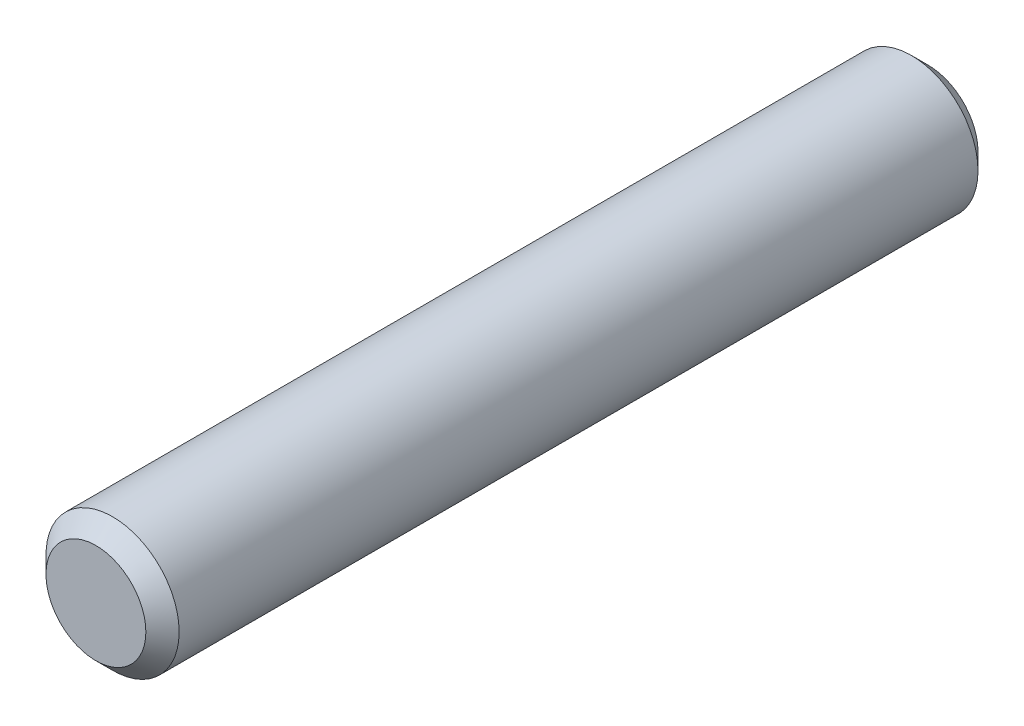
ISO-10303-21;
HEADER;
FILE_DESCRIPTION(('STEP AP214'),'2;1');
FILE_NAME('part.step','',(''),(''),'','','');
FILE_SCHEMA(('AUTOMOTIVE_DESIGN { 1 0 10303 214 1 1 1 1 }'));
ENDSEC;
DATA;
#1=APPLICATION_CONTEXT('core data for automotive mechanical design processes');
#2=APPLICATION_PROTOCOL_DEFINITION('international standard','automotive_design',2000,#1);
#3=PRODUCT_CONTEXT('',#1,'mechanical');
#4=PRODUCT('Part','Part','',(#3));
#5=PRODUCT_RELATED_PRODUCT_CATEGORY('part','',(#4));
#6=PRODUCT_DEFINITION_FORMATION('','',#4);
#7=PRODUCT_DEFINITION_CONTEXT('part definition',#1,'design');
#8=PRODUCT_DEFINITION('design','',#6,#7);
#9=PRODUCT_DEFINITION_SHAPE('','',#8);
#10=(LENGTH_UNIT() NAMED_UNIT(*) SI_UNIT(.MILLI.,.METRE.));
#11=(NAMED_UNIT(*) PLANE_ANGLE_UNIT() SI_UNIT($,.RADIAN.));
#12=(NAMED_UNIT(*) SI_UNIT($,.STERADIAN.) SOLID_ANGLE_UNIT());
#13=UNCERTAINTY_MEASURE_WITH_UNIT(LENGTH_MEASURE(1.E-05),#10,'distance_accuracy_value','');
#14=(GEOMETRIC_REPRESENTATION_CONTEXT(3) GLOBAL_UNCERTAINTY_ASSIGNED_CONTEXT((#13)) GLOBAL_UNIT_ASSIGNED_CONTEXT((#10,
#11,#12)) REPRESENTATION_CONTEXT('',''));
#15=CARTESIAN_POINT('',(0.,0.,0.));
#16=DIRECTION('',(0.,0.,1.));
#17=DIRECTION('',(1.,0.,0.));
#18=AXIS2_PLACEMENT_3D('',#15,#16,#17);
#19=CARTESIAN_POINT('',(0.,0.,50.));
#20=DIRECTION('',(0.,0.,-1.));
#21=DIRECTION('',(-1.,0.,0.));
#22=AXIS2_PLACEMENT_3D('',#19,#20,#21);
#23=CYLINDRICAL_SURFACE('',#22,4.);
#24=CARTESIAN_POINT('',(0.,0.,49.));
#25=DIRECTION('',(0.,0.,1.));
#26=DIRECTION('',(1.,0.,0.));
#27=AXIS2_PLACEMENT_3D('',#24,#25,#26);
#28=CIRCLE('',#27,4.);
#29=CARTESIAN_POINT('',(4.,0.,49.));
#30=VERTEX_POINT('',#29);
#31=EDGE_CURVE('E47',#30,#30,#28,.F.);
#32=ORIENTED_EDGE('',*,*,#31,.T.);
#33=EDGE_LOOP('',(#32));
#34=FACE_BOUND('',#33,.T.);
#35=CARTESIAN_POINT('',(0.,0.,1.));
#36=DIRECTION('',(0.,0.,1.));
#37=DIRECTION('',(1.,0.,0.));
#38=AXIS2_PLACEMENT_3D('',#35,#36,#37);
#39=CIRCLE('',#38,4.);
#40=CARTESIAN_POINT('',(4.,0.,1.));
#41=VERTEX_POINT('',#40);
#42=EDGE_CURVE('E52',#41,#41,#39,.T.);
#43=ORIENTED_EDGE('',*,*,#42,.T.);
#44=EDGE_LOOP('',(#43));
#45=FACE_BOUND('',#44,.T.);
#46=ADVANCED_FACE('F38',(#34,#45),#23,.T.);
#47=CARTESIAN_POINT('',(0.,0.,50.));
#48=DIRECTION('',(0.,0.,1.));
#49=DIRECTION('',(1.,0.,0.));
#50=AXIS2_PLACEMENT_3D('',#47,#48,#49);
#51=PLANE('',#50);
#52=CARTESIAN_POINT('',(0.,0.,50.));
#53=DIRECTION('',(0.,0.,1.));
#54=DIRECTION('',(1.,0.,0.));
#55=AXIS2_PLACEMENT_3D('',#52,#53,#54);
#56=CIRCLE('',#55,3.);
#57=CARTESIAN_POINT('',(3.,0.,50.));
#58=VERTEX_POINT('',#57);
#59=EDGE_CURVE('E57',#58,#58,#56,.T.);
#60=ORIENTED_EDGE('',*,*,#59,.T.);
#61=EDGE_LOOP('',(#60));
#62=FACE_BOUND('',#61,.T.);
#63=ADVANCED_FACE('F64',(#62),#51,.T.);
#64=CARTESIAN_POINT('',(0.,0.,0.));
#65=DIRECTION('',(0.,0.,1.));
#66=DIRECTION('',(1.,0.,0.));
#67=AXIS2_PLACEMENT_3D('',#64,#65,#66);
#68=PLANE('',#67);
#69=CARTESIAN_POINT('',(0.,0.,0.));
#70=DIRECTION('',(0.,0.,1.));
#71=DIRECTION('',(1.,0.,0.));
#72=AXIS2_PLACEMENT_3D('',#69,#70,#71);
#73=CIRCLE('',#72,2.99999999999999);
#74=CARTESIAN_POINT('',(2.99999999999999,0.,0.));
#75=VERTEX_POINT('',#74);
#76=EDGE_CURVE('E10',#75,#75,#73,.F.);
#77=ORIENTED_EDGE('',*,*,#76,.T.);
#78=EDGE_LOOP('',(#77));
#79=FACE_BOUND('',#78,.T.);
#80=ADVANCED_FACE('F68',(#79),#68,.F.);
#81=CARTESIAN_POINT('',(0.,0.,50.));
#82=DIRECTION('',(0.,0.,-1.));
#83=DIRECTION('',(-1.,0.,0.));
#84=AXIS2_PLACEMENT_3D('',#81,#82,#83);
#85=CONICAL_SURFACE('',#84,3.,0.785398163397443);
#86=ORIENTED_EDGE('',*,*,#31,.F.);
#87=EDGE_LOOP('',(#86));
#88=FACE_BOUND('',#87,.T.);
#89=ORIENTED_EDGE('',*,*,#59,.F.);
#90=EDGE_LOOP('',(#89));
#91=FACE_BOUND('',#90,.T.);
#92=ADVANCED_FACE('F66',(#88,#91),#85,.T.);
#93=CARTESIAN_POINT('',(0.,0.,1.));
#94=DIRECTION('',(0.,0.,1.));
#95=DIRECTION('',(1.,0.,0.));
#96=AXIS2_PLACEMENT_3D('',#93,#94,#95);
#97=CONICAL_SURFACE('',#96,4.,0.785398163397454);
#98=ORIENTED_EDGE('',*,*,#76,.F.);
#99=EDGE_LOOP('',(#98));
#100=FACE_BOUND('',#99,.T.);
#101=ORIENTED_EDGE('',*,*,#42,.F.);
#102=EDGE_LOOP('',(#101));
#103=FACE_BOUND('',#102,.T.);
#104=ADVANCED_FACE('F41',(#100,#103),#97,.T.);
#105=CLOSED_SHELL('',(#46,#63,#80,#92,#104));
#106=MANIFOLD_SOLID_BREP('B2',#105);
#107=ADVANCED_BREP_SHAPE_REPRESENTATION('',(#18,#106),#14);
#108=SHAPE_DEFINITION_REPRESENTATION(#9,#107);
ENDSEC;
END-ISO-10303-21;
